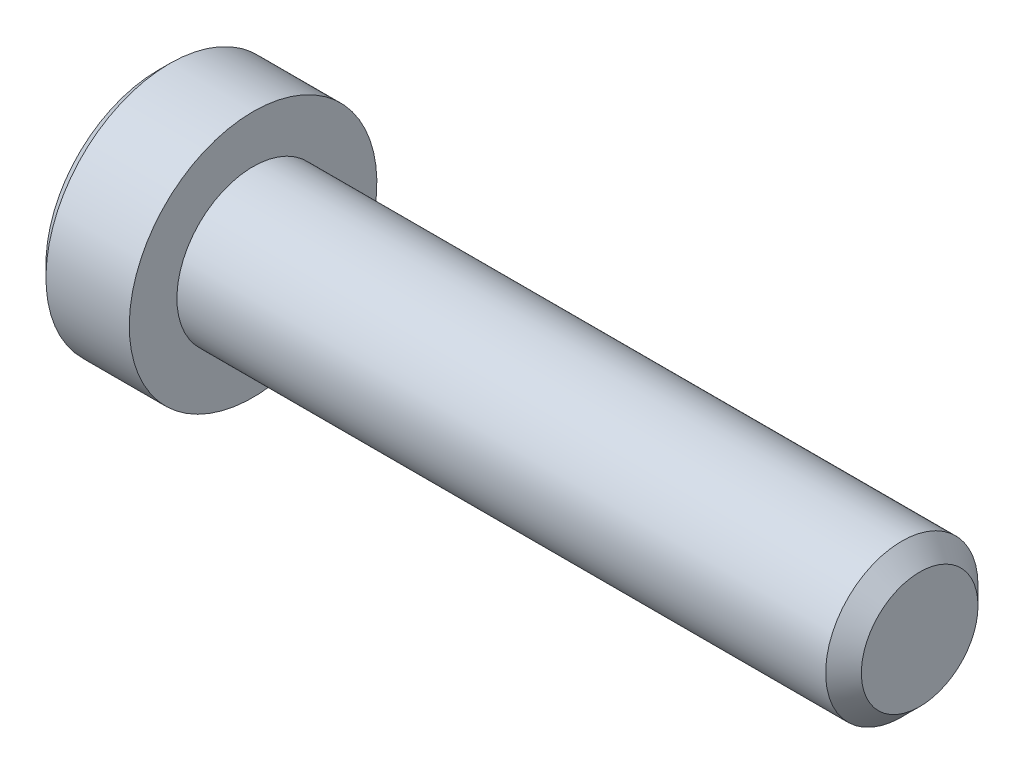
ISO-10303-21;
HEADER;
FILE_DESCRIPTION(('STEP AP214'),'2;1');
FILE_NAME('part.step','',(''),(''),'','','');
FILE_SCHEMA(('AUTOMOTIVE_DESIGN { 1 0 10303 214 1 1 1 1 }'));
ENDSEC;
DATA;
#1=APPLICATION_CONTEXT('core data for automotive mechanical design processes');
#2=APPLICATION_PROTOCOL_DEFINITION('international standard','automotive_design',2000,#1);
#3=PRODUCT_CONTEXT('',#1,'mechanical');
#4=PRODUCT('Part','Part','',(#3));
#5=PRODUCT_RELATED_PRODUCT_CATEGORY('part','',(#4));
#6=PRODUCT_DEFINITION_FORMATION('','',#4);
#7=PRODUCT_DEFINITION_CONTEXT('part definition',#1,'design');
#8=PRODUCT_DEFINITION('design','',#6,#7);
#9=PRODUCT_DEFINITION_SHAPE('','',#8);
#10=(LENGTH_UNIT() NAMED_UNIT(*) SI_UNIT(.MILLI.,.METRE.));
#11=(NAMED_UNIT(*) PLANE_ANGLE_UNIT() SI_UNIT($,.RADIAN.));
#12=(NAMED_UNIT(*) SI_UNIT($,.STERADIAN.) SOLID_ANGLE_UNIT());
#13=UNCERTAINTY_MEASURE_WITH_UNIT(LENGTH_MEASURE(1.E-05),#10,'distance_accuracy_value','');
#14=(GEOMETRIC_REPRESENTATION_CONTEXT(3) GLOBAL_UNCERTAINTY_ASSIGNED_CONTEXT((#13)) GLOBAL_UNIT_ASSIGNED_CONTEXT((#10,
#11,#12)) REPRESENTATION_CONTEXT('',''));
#15=CARTESIAN_POINT('',(0.,0.,0.));
#16=DIRECTION('',(0.,0.,1.));
#17=DIRECTION('',(1.,0.,0.));
#18=AXIS2_PLACEMENT_3D('',#15,#16,#17);
#19=CARTESIAN_POINT('',(-22.5,5.87499999999999,0.));
#20=DIRECTION('',(-1.,0.,0.));
#21=DIRECTION('',(0.,-1.,0.));
#22=AXIS2_PLACEMENT_3D('',#19,#20,#21);
#23=PLANE('',#22);
#24=CARTESIAN_POINT('',(-22.5,0.,0.));
#25=DIRECTION('',(-1.,0.,0.));
#26=DIRECTION('',(0.,-1.,0.));
#27=AXIS2_PLACEMENT_3D('',#24,#25,#26);
#28=CIRCLE('',#27,2.88675134594805);
#29=CARTESIAN_POINT('',(-22.5,-2.886751345948,-2.18358317538581E-13));
#30=VERTEX_POINT('',#29);
#31=CARTESIAN_POINT('',(-22.5,-1.44337567297417,2.49999999999982));
#32=VERTEX_POINT('',#31);
#33=EDGE_CURVE('E142',#30,#32,#28,.T.);
#34=ORIENTED_EDGE('',*,*,#33,.F.);
#35=CARTESIAN_POINT('',(-22.5,-1.44337567297406,-2.5));
#36=VERTEX_POINT('',#35);
#37=EDGE_CURVE('E139',#36,#30,#28,.T.);
#38=ORIENTED_EDGE('',*,*,#37,.F.);
#39=CARTESIAN_POINT('',(-22.5,1.44337567297394,-2.5));
#40=VERTEX_POINT('',#39);
#41=EDGE_CURVE('E107',#40,#36,#28,.T.);
#42=ORIENTED_EDGE('',*,*,#41,.F.);
#43=CARTESIAN_POINT('',(-22.5,2.88675134594809,0.));
#44=VERTEX_POINT('',#43);
#45=EDGE_CURVE('E99',#44,#40,#28,.T.);
#46=ORIENTED_EDGE('',*,*,#45,.F.);
#47=CARTESIAN_POINT('',(-22.5,1.44337567297394,2.5));
#48=VERTEX_POINT('',#47);
#49=EDGE_CURVE('E60',#48,#44,#28,.T.);
#50=ORIENTED_EDGE('',*,*,#49,.F.);
#51=EDGE_CURVE('E67',#32,#48,#28,.T.);
#52=ORIENTED_EDGE('',*,*,#51,.F.);
#53=EDGE_LOOP('',(#34,#38,#42,#46,#50,#52));
#54=FACE_BOUND('',#53,.T.);
#55=CARTESIAN_POINT('',(-22.5,0.,0.));
#56=DIRECTION('',(1.,0.,0.));
#57=DIRECTION('',(0.,1.,0.));
#58=AXIS2_PLACEMENT_3D('',#55,#56,#57);
#59=CIRCLE('',#58,5.87499999999999);
#60=CARTESIAN_POINT('',(-22.5,5.87499999999999,0.));
#61=VERTEX_POINT('',#60);
#62=EDGE_CURVE('E237',#61,#61,#59,.T.);
#63=ORIENTED_EDGE('',*,*,#62,.F.);
#64=EDGE_LOOP('',(#63));
#65=FACE_BOUND('',#64,.T.);
#66=ADVANCED_FACE('F39',(#54,#65),#23,.T.);
#67=CARTESIAN_POINT('',(-4.5,0.,0.));
#68=DIRECTION('',(1.,0.,0.));
#69=DIRECTION('',(0.,0.,-1.));
#70=AXIS2_PLACEMENT_3D('',#67,#68,#69);
#71=CYLINDRICAL_SURFACE('',#70,4.);
#72=CARTESIAN_POINT('',(16.5625,0.,0.));
#73=DIRECTION('',(1.,0.,0.));
#74=DIRECTION('',(0.,0.,-1.));
#75=AXIS2_PLACEMENT_3D('',#72,#73,#74);
#76=CIRCLE('',#75,4.);
#77=CARTESIAN_POINT('',(16.5625,0.,-4.));
#78=VERTEX_POINT('',#77);
#79=EDGE_CURVE('E54',#78,#78,#76,.F.);
#80=ORIENTED_EDGE('',*,*,#79,.T.);
#81=EDGE_LOOP('',(#80));
#82=FACE_BOUND('',#81,.T.);
#83=CARTESIAN_POINT('',(-17.5,0.,0.));
#84=DIRECTION('',(-1.,0.,0.));
#85=DIRECTION('',(0.,-1.,0.));
#86=AXIS2_PLACEMENT_3D('',#83,#84,#85);
#87=CIRCLE('',#86,4.);
#88=CARTESIAN_POINT('',(-17.5,-4.00000000000001,0.));
#89=VERTEX_POINT('',#88);
#90=EDGE_CURVE('E227',#89,#89,#87,.T.);
#91=ORIENTED_EDGE('',*,*,#90,.F.);
#92=EDGE_LOOP('',(#91));
#93=FACE_BOUND('',#92,.T.);
#94=ADVANCED_FACE('F207',(#82,#93),#71,.T.);
#95=CARTESIAN_POINT('',(17.5,0.,0.));
#96=DIRECTION('',(1.,0.,0.));
#97=DIRECTION('',(0.,0.,-1.));
#98=AXIS2_PLACEMENT_3D('',#95,#96,#97);
#99=PLANE('',#98);
#100=CARTESIAN_POINT('',(17.5,0.,0.));
#101=DIRECTION('',(1.,0.,0.));
#102=DIRECTION('',(0.,0.,-1.));
#103=AXIS2_PLACEMENT_3D('',#100,#101,#102);
#104=CIRCLE('',#103,3.0625);
#105=CARTESIAN_POINT('',(17.5,0.,-3.0625));
#106=VERTEX_POINT('',#105);
#107=EDGE_CURVE('E229',#106,#106,#104,.T.);
#108=ORIENTED_EDGE('',*,*,#107,.T.);
#109=EDGE_LOOP('',(#108));
#110=FACE_BOUND('',#109,.T.);
#111=ADVANCED_FACE('F215',(#110),#99,.T.);
#112=CARTESIAN_POINT('',(17.5,0.,0.));
#113=DIRECTION('',(-1.,0.,0.));
#114=DIRECTION('',(0.,0.,1.));
#115=AXIS2_PLACEMENT_3D('',#112,#113,#114);
#116=CONICAL_SURFACE('',#115,3.0625,0.785398163397447);
#117=ORIENTED_EDGE('',*,*,#79,.F.);
#118=EDGE_LOOP('',(#117));
#119=FACE_BOUND('',#118,.T.);
#120=ORIENTED_EDGE('',*,*,#107,.F.);
#121=EDGE_LOOP('',(#120));
#122=FACE_BOUND('',#121,.T.);
#123=ADVANCED_FACE('F41',(#119,#122),#116,.T.);
#124=CARTESIAN_POINT('',(-17.5,0.,0.));
#125=DIRECTION('',(1.,0.,0.));
#126=DIRECTION('',(0.,1.,0.));
#127=AXIS2_PLACEMENT_3D('',#124,#125,#126);
#128=CYLINDRICAL_SURFACE('',#127,6.5);
#129=CARTESIAN_POINT('',(-21.875,0.,0.));
#130=DIRECTION('',(1.,0.,0.));
#131=DIRECTION('',(0.,1.,0.));
#132=AXIS2_PLACEMENT_3D('',#129,#130,#131);
#133=CIRCLE('',#132,6.5);
#134=CARTESIAN_POINT('',(-21.875,6.49999999999999,0.));
#135=VERTEX_POINT('',#134);
#136=EDGE_CURVE('E230',#135,#135,#133,.T.);
#137=ORIENTED_EDGE('',*,*,#136,.T.);
#138=EDGE_LOOP('',(#137));
#139=FACE_BOUND('',#138,.T.);
#140=CARTESIAN_POINT('',(-17.5,0.,0.));
#141=DIRECTION('',(1.,0.,0.));
#142=DIRECTION('',(0.,1.,0.));
#143=AXIS2_PLACEMENT_3D('',#140,#141,#142);
#144=CIRCLE('',#143,6.5);
#145=CARTESIAN_POINT('',(-17.5,6.49999999999999,0.));
#146=VERTEX_POINT('',#145);
#147=EDGE_CURVE('E244',#146,#146,#144,.T.);
#148=ORIENTED_EDGE('',*,*,#147,.F.);
#149=EDGE_LOOP('',(#148));
#150=FACE_BOUND('',#149,.T.);
#151=ADVANCED_FACE('F210',(#139,#150),#128,.T.);
#152=CARTESIAN_POINT('',(-21.875,0.,0.));
#153=DIRECTION('',(1.,0.,0.));
#154=DIRECTION('',(0.,1.,0.));
#155=AXIS2_PLACEMENT_3D('',#152,#153,#154);
#156=CONICAL_SURFACE('',#155,6.5,0.785398163397449);
#157=ORIENTED_EDGE('',*,*,#62,.T.);
#158=EDGE_LOOP('',(#157));
#159=FACE_BOUND('',#158,.T.);
#160=ORIENTED_EDGE('',*,*,#136,.F.);
#161=EDGE_LOOP('',(#160));
#162=FACE_BOUND('',#161,.T.);
#163=ADVANCED_FACE('F203',(#159,#162),#156,.T.);
#164=CARTESIAN_POINT('',(-17.5,6.49999999999999,0.));
#165=DIRECTION('',(1.,0.,0.));
#166=DIRECTION('',(0.,1.,0.));
#167=AXIS2_PLACEMENT_3D('',#164,#165,#166);
#168=PLANE('',#167);
#169=ORIENTED_EDGE('',*,*,#90,.T.);
#170=EDGE_LOOP('',(#169));
#171=FACE_BOUND('',#170,.T.);
#172=ORIENTED_EDGE('',*,*,#147,.T.);
#173=EDGE_LOOP('',(#172));
#174=FACE_BOUND('',#173,.T.);
#175=ADVANCED_FACE('F166',(#171,#174),#168,.T.);
#176=CARTESIAN_POINT('',(-22.5,0.,0.));
#177=DIRECTION('',(-1.,0.,0.));
#178=DIRECTION('',(0.,-1.,0.));
#179=AXIS2_PLACEMENT_3D('',#176,#177,#178);
#180=CONICAL_SURFACE('',#179,2.88675134594805,0.78539816339745);
#181=CARTESIAN_POINT('',(-23.4259641937848,-2.87868021616152,-2.5));
#182=CARTESIAN_POINT('',(-23.3730547693996,-2.80858751756352,-2.5));
#183=CARTESIAN_POINT('',(-23.3206567848066,-2.73810237384455,-2.5));
#184=CARTESIAN_POINT('',(-23.2171126835153,-2.59619238907466,-2.5));
#185=CARTESIAN_POINT('',(-23.165966884378,-2.5247673165714,-2.5));
#186=CARTESIAN_POINT('',(-23.0647924979815,-2.38030019419695,-2.5));
#187=CARTESIAN_POINT('',(-23.0147756377846,-2.30724990359397,-2.5));
#188=CARTESIAN_POINT('',(-22.9166088439156,-2.15990937397291,-2.5));
#189=CARTESIAN_POINT('',(-22.8684587783456,-2.0856192230894,-2.5));
#190=CARTESIAN_POINT('',(-22.7717465594521,-1.93130274871405,-2.5));
#191=CARTESIAN_POINT('',(-22.7233189325374,-1.85119168497847,-2.5));
#192=CARTESIAN_POINT('',(-22.6296640597042,-1.68912282627164,-2.5));
#193=CARTESIAN_POINT('',(-22.5844363916949,-1.60716527674861,-2.5));
#194=CARTESIAN_POINT('',(-22.4981353746694,-1.44137668632316,-2.5));
#195=CARTESIAN_POINT('',(-22.4570503726637,-1.35755175925792,-2.5));
#196=CARTESIAN_POINT('',(-22.3799618661067,-1.18761577759417,-2.5));
#197=CARTESIAN_POINT('',(-22.3439560607347,-1.10150577924726,-2.5));
#198=CARTESIAN_POINT('',(-22.2809497442852,-0.933895283730341,-2.5));
#199=CARTESIAN_POINT('',(-22.2534577201432,-0.852581486652378,-2.5));
#200=CARTESIAN_POINT('',(-22.2049971144175,-0.68799618505139,-2.5));
#201=CARTESIAN_POINT('',(-22.1840289822391,-0.604724546085127,-2.5));
#202=CARTESIAN_POINT('',(-22.1500599950131,-0.438105786501612,-2.5));
#203=CARTESIAN_POINT('',(-22.1369226334437,-0.354786957377844,-2.5));
#204=CARTESIAN_POINT('',(-22.1188701943997,-0.187258638268733,-2.5));
#205=CARTESIAN_POINT('',(-22.1139537035303,-0.103049303891694,-2.5));
#206=CARTESIAN_POINT('',(-22.112708074372,0.0623819458555894,-2.5));
#207=CARTESIAN_POINT('',(-22.116074551711,0.143601667742535,-2.5));
#208=CARTESIAN_POINT('',(-22.130537592381,0.305344840534005,-2.5));
#209=CARTESIAN_POINT('',(-22.1416349066532,0.385868223029699,-2.5));
#210=CARTESIAN_POINT('',(-22.1711420785854,0.546999992477772,-2.5));
#211=CARTESIAN_POINT('',(-22.189676376831,0.627585258156421,-2.5));
#212=CARTESIAN_POINT('',(-22.2330723320142,0.786991930978629,-2.5));
#213=CARTESIAN_POINT('',(-22.2579334595175,0.865813485110866,-2.5));
#214=CARTESIAN_POINT('',(-22.3455589112399,1.11399280220495,-2.5));
#215=CARTESIAN_POINT('',(-22.4183033354747,1.2798402752946,-2.5));
#216=CARTESIAN_POINT('',(-22.5395423452679,1.52253018655043,-2.5));
#217=CARTESIAN_POINT('',(-22.5820714512073,1.60256472908883,-2.5));
#218=CARTESIAN_POINT('',(-22.6703965241523,1.76081489282128,-2.5));
#219=CARTESIAN_POINT('',(-22.7161919024768,1.83903083842891,-2.5));
#220=CARTESIAN_POINT('',(-22.8080446787287,1.99000684607172,-2.5));
#221=CARTESIAN_POINT('',(-22.8539756354245,2.06284472030448,-2.5));
#222=CARTESIAN_POINT('',(-22.9477702453866,2.20727164736139,-2.5));
#223=CARTESIAN_POINT('',(-22.9956340450437,2.27886060500406,-2.5));
#224=CARTESIAN_POINT('',(-23.0925522363184,2.42037078548407,-2.5));
#225=CARTESIAN_POINT('',(-23.1415937983163,2.49030083172882,-2.5));
#226=CARTESIAN_POINT('',(-23.2409738351899,2.62920524991562,-2.5));
#227=CARTESIAN_POINT('',(-23.2913119497075,2.69817987937843,-2.5));
#228=CARTESIAN_POINT('',(-23.3421802976825,2.76675463365827,-2.5));
#229=B_SPLINE_CURVE_WITH_KNOTS('',3,(#181,#182,#183,#184,#185,#186,#187,#188,#189,#190,#191,
#192,#193,#194,#195,#196,#197,#198,#199,#200,#201,#202,#203,#204,#205,#206,#207,#208,#209,#210,
#211,#212,#213,#214,#215,#216,#217,#218,#219,#220,#221,#222,#223,#224,#225,#226,#227,#228),
.UNSPECIFIED.,.F.,.F.,(4,2,2,2,2,2,2,2,2,2,2,2,2,2,2,2,2,2,2,2,2,2,2,4),(0.,0.263465914971116,
0.526997968323241,0.792571943279366,1.05812711983772,1.33890112548019,1.6196380262908,
1.89956181222217,2.17935838571898,2.43663887682601,2.69393708705249,2.94660788173137,
3.19923523085018,3.44271854486788,3.68622551313361,3.93398926860575,4.1817322978197,
4.7233400484191,4.99521600382016,5.26704308216968,5.52534341671995,5.78366335141088,
6.03988492204048,6.29603603207542),.UNSPECIFIED.);
#230=EDGE_CURVE('E11',#36,#40,#229,.T.);
#231=ORIENTED_EDGE('',*,*,#230,.T.);
#232=ORIENTED_EDGE('',*,*,#41,.T.);
#233=EDGE_LOOP('',(#231,#232));
#234=FACE_BOUND('',#233,.T.);
#235=ADVANCED_FACE('F112',(#234),#180,.F.);
#236=CARTESIAN_POINT('',(-22.5001154769819,-2.88686681600197,0.000200000000000396));
#237=CARTESIAN_POINT('',(-22.4505407053549,-2.83725032818751,-0.0857382777877663));
#238=CARTESIAN_POINT('',(-22.4038774813626,-2.78680418128109,-0.173113567275756));
#239=CARTESIAN_POINT('',(-22.3184381400384,-2.6839389026696,-0.351281456165594));
#240=CARTESIAN_POINT('',(-22.2797095624061,-2.6315099876986,-0.442091000681081));
#241=CARTESIAN_POINT('',(-22.2133667038979,-2.52578957716233,-0.625204123126929));
#242=CARTESIAN_POINT('',(-22.185585668531,-2.47252500720903,-0.71746106452935));
#243=CARTESIAN_POINT('',(-22.1427831759108,-2.36482323343209,-0.904006008776298));
#244=CARTESIAN_POINT('',(-22.1277297666715,-2.31038931995912,-0.998288312566297));
#245=CARTESIAN_POINT('',(-22.1141477222096,-2.21657570605386,-1.16077825829186));
#246=CARTESIAN_POINT('',(-22.1121370992409,-2.17731721011877,-1.22877596788017));
#247=CARTESIAN_POINT('',(-22.1155241171876,-2.09886438835669,-1.36466024116924));
#248=CARTESIAN_POINT('',(-22.1209243553,-2.05967008984861,-1.43254675755226));
#249=CARTESIAN_POINT('',(-22.1388257884026,-1.98165157555713,-1.56767878823613));
#250=CARTESIAN_POINT('',(-22.1513349270466,-1.94282782326095,-1.63492349975358));
#251=CARTESIAN_POINT('',(-22.1827675019558,-1.86585167424615,-1.76825010081822));
#252=CARTESIAN_POINT('',(-22.201690446497,-1.82769922629676,-1.83433207909968));
#253=CARTESIAN_POINT('',(-22.2578673614084,-1.72997445583857,-2.00359634669128));
#254=CARTESIAN_POINT('',(-22.2993558315963,-1.6710080703923,-2.10572912222291));
#255=CARTESIAN_POINT('',(-22.3693940467232,-1.58430317001562,-2.25590641494052));
#256=CARTESIAN_POINT('',(-22.3940022521162,-1.55573003305807,-2.30539653988262));
#257=CARTESIAN_POINT('',(-22.4454618867153,-1.49911303110425,-2.40346006383885));
#258=CARTESIAN_POINT('',(-22.4723119387795,-1.47106885396706,-2.45203400349693));
#259=CARTESIAN_POINT('',(-22.5001154769819,-1.44326020292023,-2.5002));
#260=B_SPLINE_CURVE_WITH_KNOTS('',3,(#236,#237,#238,#239,#240,#241,#242,#243,#244,#245,#246,
#247,#248,#249,#250,#251,#252,#253,#254,#255,#256,#257,#258,#259),.UNSPECIFIED.,.F.,.F.,(4,2,2,
2,2,2,2,2,2,2,2,4),(0.,0.33301208513393,0.667964518301407,0.997597032043313,1.32639954393846,
1.56169424147171,1.79707142102085,2.03271213522174,2.26833478775654,2.64260240809534,
2.82922877818864,3.01574133749024),.UNSPECIFIED.);
#261=EDGE_CURVE('E145',#30,#36,#260,.T.);
#262=ORIENTED_EDGE('',*,*,#261,.T.);
#263=ORIENTED_EDGE('',*,*,#37,.T.);
#264=EDGE_LOOP('',(#262,#263));
#265=FACE_BOUND('',#264,.T.);
#266=ADVANCED_FACE('F165',(#265),#180,.F.);
#267=CARTESIAN_POINT('',(-22.5001154769819,-1.44326020292023,2.5002));
#268=CARTESIAN_POINT('',(-22.4505407053548,-1.49287669073468,2.41426172221224));
#269=CARTESIAN_POINT('',(-22.4038774813626,-1.5433228376411,2.32688643272425));
#270=CARTESIAN_POINT('',(-22.3184381400384,-1.64618811625259,2.14871854383442));
#271=CARTESIAN_POINT('',(-22.2797095624061,-1.69861703122359,2.05790899931893));
#272=CARTESIAN_POINT('',(-22.2133667038979,-1.80433744175985,1.87479587687309));
#273=CARTESIAN_POINT('',(-22.185585668531,-1.85760201171315,1.78253893547067));
#274=CARTESIAN_POINT('',(-22.1427831759108,-1.96530378549008,1.59599399122373));
#275=CARTESIAN_POINT('',(-22.1277297666715,-2.01973769896306,1.50171168743373));
#276=CARTESIAN_POINT('',(-22.1141477222096,-2.11355131286832,1.33922174170817));
#277=CARTESIAN_POINT('',(-22.1121370992409,-2.1528098088034,1.27122403211986));
#278=CARTESIAN_POINT('',(-22.1155241171876,-2.23126263056549,1.13533975883079));
#279=CARTESIAN_POINT('',(-22.1209243553,-2.27045692907357,1.06745324244777));
#280=CARTESIAN_POINT('',(-22.1388257884026,-2.34847544336504,0.932321211763906));
#281=CARTESIAN_POINT('',(-22.1513349270466,-2.38729919566122,0.86507650024645));
#282=CARTESIAN_POINT('',(-22.1827675019558,-2.46427534467603,0.731749899181811));
#283=CARTESIAN_POINT('',(-22.201690446497,-2.50242779262541,0.665667920900352));
#284=CARTESIAN_POINT('',(-22.2578673614084,-2.60015256308361,0.496403653308742));
#285=CARTESIAN_POINT('',(-22.2993558315963,-2.65911894852988,0.394270877777112));
#286=CARTESIAN_POINT('',(-22.3693940467232,-2.74582384890657,0.244093585059495));
#287=CARTESIAN_POINT('',(-22.3940022521162,-2.77439698586412,0.194603460117394));
#288=CARTESIAN_POINT('',(-22.4454618867154,-2.83101398781794,0.096539936161156));
#289=CARTESIAN_POINT('',(-22.4723119387795,-2.85905816495513,0.0479659965030741));
#290=CARTESIAN_POINT('',(-22.5001154769819,-2.88686681600197,-0.000199999999999266));
#291=B_SPLINE_CURVE_WITH_KNOTS('',3,(#267,#268,#269,#270,#271,#272,#273,#274,#275,#276,#277,
#278,#279,#280,#281,#282,#283,#284,#285,#286,#287,#288,#289,#290),.UNSPECIFIED.,.F.,.F.,(4,2,2,
2,2,2,2,2,2,2,2,4),(0.,0.333012085133918,0.667964518301386,0.997597032043283,1.32639954393842,
1.56169424147167,1.79707142102081,2.03271213522169,2.26833478775649,2.64260240809532,
2.82922877818863,3.01574133749024),.UNSPECIFIED.);
#292=EDGE_CURVE('E153',#32,#30,#291,.T.);
#293=ORIENTED_EDGE('',*,*,#292,.T.);
#294=ORIENTED_EDGE('',*,*,#33,.T.);
#295=EDGE_LOOP('',(#293,#294));
#296=FACE_BOUND('',#295,.T.);
#297=ADVANCED_FACE('F291',(#296),#180,.F.);
#298=CARTESIAN_POINT('',(-23.4259641937848,-2.87868021616152,2.5));
#299=CARTESIAN_POINT('',(-23.3730547693996,-2.80858751756352,2.5));
#300=CARTESIAN_POINT('',(-23.3206567848066,-2.73810237384455,2.5));
#301=CARTESIAN_POINT('',(-23.2171126835153,-2.59619238907467,2.5));
#302=CARTESIAN_POINT('',(-23.165966884378,-2.5247673165714,2.5));
#303=CARTESIAN_POINT('',(-23.0647924979815,-2.38030019419695,2.5));
#304=CARTESIAN_POINT('',(-23.0147756377846,-2.30724990359397,2.5));
#305=CARTESIAN_POINT('',(-22.9166088439156,-2.15990937397291,2.5));
#306=CARTESIAN_POINT('',(-22.8684587783456,-2.0856192230894,2.5));
#307=CARTESIAN_POINT('',(-22.7717465594521,-1.93130274871405,2.5));
#308=CARTESIAN_POINT('',(-22.7233189325374,-1.85119168497847,2.5));
#309=CARTESIAN_POINT('',(-22.6296640597042,-1.68912282627164,2.5));
#310=CARTESIAN_POINT('',(-22.5844363916949,-1.60716527674861,2.5));
#311=CARTESIAN_POINT('',(-22.4981353746694,-1.44137668632315,2.5));
#312=CARTESIAN_POINT('',(-22.4570503726637,-1.35755175925792,2.5));
#313=CARTESIAN_POINT('',(-22.3799618661067,-1.18761577759417,2.5));
#314=CARTESIAN_POINT('',(-22.3439560607347,-1.10150577924726,2.5));
#315=CARTESIAN_POINT('',(-22.2809497442852,-0.93389528373034,2.5));
#316=CARTESIAN_POINT('',(-22.2534577201432,-0.852581486652378,2.5));
#317=CARTESIAN_POINT('',(-22.2049971144175,-0.687996185051391,2.5));
#318=CARTESIAN_POINT('',(-22.1840289822391,-0.604724546085127,2.5));
#319=CARTESIAN_POINT('',(-22.1500599950131,-0.438105786501613,2.5));
#320=CARTESIAN_POINT('',(-22.1369226334437,-0.354786957377844,2.5));
#321=CARTESIAN_POINT('',(-22.1188701943997,-0.187258638268734,2.5));
#322=CARTESIAN_POINT('',(-22.1139537035303,-0.103049303891695,2.5));
#323=CARTESIAN_POINT('',(-22.112708074372,0.0623819458555882,2.5));
#324=CARTESIAN_POINT('',(-22.116074551711,0.143601667742533,2.5));
#325=CARTESIAN_POINT('',(-22.130537592381,0.305344840534004,2.5));
#326=CARTESIAN_POINT('',(-22.1416349066532,0.385868223029698,2.5));
#327=CARTESIAN_POINT('',(-22.1711420785854,0.546999992477771,2.5));
#328=CARTESIAN_POINT('',(-22.189676376831,0.62758525815642,2.5));
#329=CARTESIAN_POINT('',(-22.2330723320142,0.786991930978628,2.5));
#330=CARTESIAN_POINT('',(-22.2579334595175,0.865813485110865,2.5));
#331=CARTESIAN_POINT('',(-22.3455589112399,1.11399280220495,2.5));
#332=CARTESIAN_POINT('',(-22.4183033354747,1.2798402752946,2.5));
#333=CARTESIAN_POINT('',(-22.5395423452679,1.52253018655042,2.5));
#334=CARTESIAN_POINT('',(-22.5820714512073,1.60256472908883,2.5));
#335=CARTESIAN_POINT('',(-22.6703965241523,1.76081489282128,2.5));
#336=CARTESIAN_POINT('',(-22.7161919024768,1.8390308384289,2.5));
#337=CARTESIAN_POINT('',(-22.8080446787287,1.99000684607171,2.5));
#338=CARTESIAN_POINT('',(-22.8539756354245,2.06284472030448,2.5));
#339=CARTESIAN_POINT('',(-22.9477702453866,2.20727164736139,2.5));
#340=CARTESIAN_POINT('',(-22.9956340450437,2.27886060500406,2.5));
#341=CARTESIAN_POINT('',(-23.0925522363184,2.42037078548406,2.5));
#342=CARTESIAN_POINT('',(-23.1415937983163,2.49030083172882,2.5));
#343=CARTESIAN_POINT('',(-23.2409738351899,2.62920524991562,2.5));
#344=CARTESIAN_POINT('',(-23.2913119497075,2.69817987937843,2.5));
#345=CARTESIAN_POINT('',(-23.3421802976825,2.76675463365827,2.5));
#346=B_SPLINE_CURVE_WITH_KNOTS('',3,(#298,#299,#300,#301,#302,#303,#304,#305,#306,#307,#308,
#309,#310,#311,#312,#313,#314,#315,#316,#317,#318,#319,#320,#321,#322,#323,#324,#325,#326,#327,
#328,#329,#330,#331,#332,#333,#334,#335,#336,#337,#338,#339,#340,#341,#342,#343,#344,#345),
.UNSPECIFIED.,.F.,.F.,(4,2,2,2,2,2,2,2,2,2,2,2,2,2,2,2,2,2,2,2,2,2,2,4),(0.,0.263465914971117,
0.526997968323243,0.792571943279369,1.05812711983772,1.3389011254802,1.6196380262908,
1.89956181222218,2.17935838571899,2.43663887682602,2.69393708705249,2.94660788173137,
3.19923523085018,3.44271854486788,3.68622551313362,3.93398926860575,4.1817322978197,
4.7233400484191,4.99521600382016,5.26704308216968,5.52534341671995,5.78366335141087,
6.03988492204048,6.29603603207542),.UNSPECIFIED.);
#347=EDGE_CURVE('E173',#48,#32,#346,.F.);
#348=ORIENTED_EDGE('',*,*,#347,.T.);
#349=ORIENTED_EDGE('',*,*,#51,.T.);
#350=EDGE_LOOP('',(#348,#349));
#351=FACE_BOUND('',#350,.T.);
#352=ADVANCED_FACE('F309',(#351),#180,.F.);
#353=CARTESIAN_POINT('',(-22.5001154769818,2.88686681600197,-0.000199999999999272));
#354=CARTESIAN_POINT('',(-22.4505407053548,2.83725032818751,0.0857382777877651));
#355=CARTESIAN_POINT('',(-22.4038774813625,2.7868041812811,0.173113567275753));
#356=CARTESIAN_POINT('',(-22.3184381400383,2.6839389026696,0.351281456165586));
#357=CARTESIAN_POINT('',(-22.279709562406,2.6315099876986,0.44209100068107));
#358=CARTESIAN_POINT('',(-22.2133667038978,2.52578957716234,0.625204123126914));
#359=CARTESIAN_POINT('',(-22.1855856685309,2.47252500720904,0.717461064529332));
#360=CARTESIAN_POINT('',(-22.1427831759107,2.36482323343211,0.904006008776275));
#361=CARTESIAN_POINT('',(-22.1277297666714,2.31038931995913,0.998288312566271));
#362=CARTESIAN_POINT('',(-22.1141477222095,2.21657570605388,1.16077825829183));
#363=CARTESIAN_POINT('',(-22.1121370992408,2.17731721011879,1.22877596788013));
#364=CARTESIAN_POINT('',(-22.1155241171875,2.09886438835671,1.3646602411692));
#365=CARTESIAN_POINT('',(-22.1209243552999,2.05967008984863,1.43254675755222));
#366=CARTESIAN_POINT('',(-22.1388257884025,1.98165157555716,1.56767878823609));
#367=CARTESIAN_POINT('',(-22.1513349270465,1.94282782326098,1.63492349975354));
#368=CARTESIAN_POINT('',(-22.1827675019558,1.86585167424617,1.76825010081818));
#369=CARTESIAN_POINT('',(-22.2016904464969,1.82769922629679,1.83433207909963));
#370=CARTESIAN_POINT('',(-22.2578673614083,1.72997445583859,2.00359634669124));
#371=CARTESIAN_POINT('',(-22.2993558315962,1.67100807039232,2.10572912222288));
#372=CARTESIAN_POINT('',(-22.3693940467231,1.58430317001563,2.2559064149405));
#373=CARTESIAN_POINT('',(-22.3940022521161,1.55573003305808,2.3053965398826));
#374=CARTESIAN_POINT('',(-22.4454618867153,1.49911303110426,2.40346006383884));
#375=CARTESIAN_POINT('',(-22.4723119387794,1.47106885396706,2.45203400349693));
#376=CARTESIAN_POINT('',(-22.5001154769818,1.44326020292023,2.5002));
#377=B_SPLINE_CURVE_WITH_KNOTS('',3,(#353,#354,#355,#356,#357,#358,#359,#360,#361,#362,#363,
#364,#365,#366,#367,#368,#369,#370,#371,#372,#373,#374,#375,#376),.UNSPECIFIED.,.F.,.F.,(4,2,2,
2,2,2,2,2,2,2,2,4),(0.,0.333012085133919,0.667964518301388,0.997597032043285,1.32639954393842,
1.56169424147166,1.7970714210208,2.03271213522168,2.26833478775647,2.64260240809532,
2.82922877818863,3.01574133749025),.UNSPECIFIED.);
#378=EDGE_CURVE('E128',#44,#48,#377,.T.);
#379=ORIENTED_EDGE('',*,*,#378,.T.);
#380=ORIENTED_EDGE('',*,*,#49,.T.);
#381=EDGE_LOOP('',(#379,#380));
#382=FACE_BOUND('',#381,.T.);
#383=ADVANCED_FACE('F281',(#382),#180,.F.);
#384=CARTESIAN_POINT('',(-22.5001154769818,1.44326020292023,-2.5002));
#385=CARTESIAN_POINT('',(-22.4505407053548,1.49287669073469,-2.41426172221224));
#386=CARTESIAN_POINT('',(-22.4038774813626,1.5433228376411,-2.32688643272425));
#387=CARTESIAN_POINT('',(-22.3184381400384,1.64618811625259,-2.14871854383441));
#388=CARTESIAN_POINT('',(-22.2797095624061,1.6986170312236,-2.05790899931892));
#389=CARTESIAN_POINT('',(-22.2133667038978,1.80433744175986,-1.87479587687307));
#390=CARTESIAN_POINT('',(-22.1855856685309,1.85760201171316,-1.78253893547065));
#391=CARTESIAN_POINT('',(-22.1427831759107,1.9653037854901,-1.5959939912237));
#392=CARTESIAN_POINT('',(-22.1277297666714,2.01973769896307,-1.5017116874337));
#393=CARTESIAN_POINT('',(-22.1141477222095,2.11355131286834,-1.33922174170814));
#394=CARTESIAN_POINT('',(-22.1121370992408,2.15280980880342,-1.27122403211983));
#395=CARTESIAN_POINT('',(-22.1155241171875,2.2312626305655,-1.13533975883077));
#396=CARTESIAN_POINT('',(-22.1209243552999,2.27045692907358,-1.06745324244775));
#397=CARTESIAN_POINT('',(-22.1388257884025,2.34847544336505,-0.932321211763882));
#398=CARTESIAN_POINT('',(-22.1513349270465,2.38729919566123,-0.865076500246428));
#399=CARTESIAN_POINT('',(-22.1827675019558,2.46427534467604,-0.731749899181791));
#400=CARTESIAN_POINT('',(-22.2016904464969,2.50242779262542,-0.665667920900334));
#401=CARTESIAN_POINT('',(-22.2578673614083,2.60015256308362,-0.496403653308729));
#402=CARTESIAN_POINT('',(-22.2993558315962,2.65911894852989,-0.394270877777102));
#403=CARTESIAN_POINT('',(-22.3693940467231,2.74582384890657,-0.244093585059489));
#404=CARTESIAN_POINT('',(-22.3940022521161,2.77439698586412,-0.194603460117389));
#405=CARTESIAN_POINT('',(-22.4454618867153,2.83101398781794,-0.0965399361611533));
#406=CARTESIAN_POINT('',(-22.4723119387794,2.85905816495513,-0.0479659965030724));
#407=CARTESIAN_POINT('',(-22.5001154769818,2.88686681600197,0.000199999999999518));
#408=B_SPLINE_CURVE_WITH_KNOTS('',3,(#384,#385,#386,#387,#388,#389,#390,#391,#392,#393,#394,
#395,#396,#397,#398,#399,#400,#401,#402,#403,#404,#405,#406,#407),.UNSPECIFIED.,.F.,.F.,(4,2,2,
2,2,2,2,2,2,2,2,4),(0.,0.333012085133929,0.667964518301408,0.997597032043317,1.32639954393847,
1.56169424147171,1.79707142102085,2.03271213522172,2.26833478775652,2.64260240809534,
2.82922877818864,3.01574133749025),.UNSPECIFIED.);
#409=EDGE_CURVE('E102',#40,#44,#408,.T.);
#410=ORIENTED_EDGE('',*,*,#409,.T.);
#411=ORIENTED_EDGE('',*,*,#45,.T.);
#412=EDGE_LOOP('',(#410,#411));
#413=FACE_BOUND('',#412,.T.);
#414=ADVANCED_FACE('F100',(#413),#180,.F.);
#415=CARTESIAN_POINT('',(-18.55,2.88675134594813,0.));
#416=DIRECTION('',(1.,0.,0.));
#417=DIRECTION('',(0.,0.,-1.));
#418=AXIS2_PLACEMENT_3D('',#415,#416,#417);
#419=PLANE('',#418);
#420=DIRECTION('',(0.,0.5,0.866025403784439));
#421=VECTOR('',#420,1.);
#422=CARTESIAN_POINT('',(-18.55,1.44337567297406,-2.5));
#423=LINE('',#422,#421);
#424=CARTESIAN_POINT('',(-18.55,1.44337567297406,-2.5));
#425=VERTEX_POINT('',#424);
#426=CARTESIAN_POINT('',(-18.55,2.88675134594813,0.));
#427=VERTEX_POINT('',#426);
#428=EDGE_CURVE('E127',#425,#427,#423,.T.);
#429=ORIENTED_EDGE('',*,*,#428,.F.);
#430=DIRECTION('',(0.,1.,0.));
#431=VECTOR('',#430,1.);
#432=CARTESIAN_POINT('',(-18.55,-1.44337567297406,-2.5));
#433=LINE('',#432,#431);
#434=CARTESIAN_POINT('',(-18.55,-1.44337567297406,-2.5));
#435=VERTEX_POINT('',#434);
#436=EDGE_CURVE('E132',#435,#425,#433,.T.);
#437=ORIENTED_EDGE('',*,*,#436,.F.);
#438=DIRECTION('',(0.,0.5,-0.866025403784439));
#439=VECTOR('',#438,1.);
#440=CARTESIAN_POINT('',(-18.55,-2.88675134594813,0.));
#441=LINE('',#440,#439);
#442=CARTESIAN_POINT('',(-18.55,-2.88675134594813,0.));
#443=VERTEX_POINT('',#442);
#444=EDGE_CURVE('E266',#443,#435,#441,.T.);
#445=ORIENTED_EDGE('',*,*,#444,.F.);
#446=DIRECTION('',(0.,-0.5,-0.866025403784439));
#447=VECTOR('',#446,1.);
#448=CARTESIAN_POINT('',(-18.55,-1.44337567297406,2.5));
#449=LINE('',#448,#447);
#450=CARTESIAN_POINT('',(-18.55,-1.44337567297406,2.5));
#451=VERTEX_POINT('',#450);
#452=EDGE_CURVE('E269',#451,#443,#449,.T.);
#453=ORIENTED_EDGE('',*,*,#452,.F.);
#454=DIRECTION('',(0.,-1.,0.));
#455=VECTOR('',#454,1.);
#456=CARTESIAN_POINT('',(-18.55,1.44337567297406,2.5));
#457=LINE('',#456,#455);
#458=CARTESIAN_POINT('',(-18.55,1.44337567297406,2.5));
#459=VERTEX_POINT('',#458);
#460=EDGE_CURVE('E272',#459,#451,#457,.T.);
#461=ORIENTED_EDGE('',*,*,#460,.F.);
#462=DIRECTION('',(0.,-0.5,0.866025403784439));
#463=VECTOR('',#462,1.);
#464=CARTESIAN_POINT('',(-18.55,2.88675134594813,0.));
#465=LINE('',#464,#463);
#466=EDGE_CURVE('E275',#427,#459,#465,.T.);
#467=ORIENTED_EDGE('',*,*,#466,.F.);
#468=EDGE_LOOP('',(#429,#437,#445,#453,#461,#467));
#469=FACE_BOUND('',#468,.T.);
#470=ADVANCED_FACE('F167',(#469),#419,.F.);
#471=CARTESIAN_POINT('',(-18.55,-1.44337567297406,-2.5));
#472=DIRECTION('',(0.,0.,1.));
#473=DIRECTION('',(1.,0.,0.));
#474=AXIS2_PLACEMENT_3D('',#471,#472,#473);
#475=PLANE('',#474);
#476=ORIENTED_EDGE('',*,*,#230,.F.);
#477=DIRECTION('',(-1.,0.,0.));
#478=VECTOR('',#477,1.);
#479=CARTESIAN_POINT('',(-18.55,-1.44337567297406,-2.5));
#480=LINE('',#479,#478);
#481=EDGE_CURVE('E134',#435,#36,#480,.T.);
#482=ORIENTED_EDGE('',*,*,#481,.F.);
#483=ORIENTED_EDGE('',*,*,#436,.T.);
#484=DIRECTION('',(-1.,0.,0.));
#485=VECTOR('',#484,1.);
#486=CARTESIAN_POINT('',(-18.55,1.44337567297406,-2.5));
#487=LINE('',#486,#485);
#488=EDGE_CURVE('E122',#425,#40,#487,.T.);
#489=ORIENTED_EDGE('',*,*,#488,.T.);
#490=EDGE_LOOP('',(#476,#482,#483,#489));
#491=FACE_BOUND('',#490,.T.);
#492=ADVANCED_FACE('F130',(#491),#475,.T.);
#493=CARTESIAN_POINT('',(-18.55,-2.88675134594813,0.));
#494=DIRECTION('',(0.,0.866025403784439,0.5));
#495=DIRECTION('',(0.,-0.5,0.866025403784439));
#496=AXIS2_PLACEMENT_3D('',#493,#494,#495);
#497=PLANE('',#496);
#498=ORIENTED_EDGE('',*,*,#261,.F.);
#499=DIRECTION('',(-1.,0.,0.));
#500=VECTOR('',#499,1.);
#501=CARTESIAN_POINT('',(-18.55,-2.88675134594813,0.));
#502=LINE('',#501,#500);
#503=EDGE_CURVE('E258',#443,#30,#502,.T.);
#504=ORIENTED_EDGE('',*,*,#503,.F.);
#505=ORIENTED_EDGE('',*,*,#444,.T.);
#506=ORIENTED_EDGE('',*,*,#481,.T.);
#507=EDGE_LOOP('',(#498,#504,#505,#506));
#508=FACE_BOUND('',#507,.T.);
#509=ADVANCED_FACE('F160',(#508),#497,.T.);
#510=CARTESIAN_POINT('',(-18.55,-1.44337567297406,2.5));
#511=DIRECTION('',(0.,0.866025403784439,-0.5));
#512=DIRECTION('',(0.,0.5,0.866025403784439));
#513=AXIS2_PLACEMENT_3D('',#510,#511,#512);
#514=PLANE('',#513);
#515=ORIENTED_EDGE('',*,*,#292,.F.);
#516=DIRECTION('',(-1.,0.,0.));
#517=VECTOR('',#516,1.);
#518=CARTESIAN_POINT('',(-18.55,-1.44337567297406,2.5));
#519=LINE('',#518,#517);
#520=EDGE_CURVE('E254',#451,#32,#519,.T.);
#521=ORIENTED_EDGE('',*,*,#520,.F.);
#522=ORIENTED_EDGE('',*,*,#452,.T.);
#523=ORIENTED_EDGE('',*,*,#503,.T.);
#524=EDGE_LOOP('',(#515,#521,#522,#523));
#525=FACE_BOUND('',#524,.T.);
#526=ADVANCED_FACE('F297',(#525),#514,.T.);
#527=CARTESIAN_POINT('',(-18.55,1.44337567297406,2.5));
#528=DIRECTION('',(0.,0.,-1.));
#529=DIRECTION('',(-1.,0.,0.));
#530=AXIS2_PLACEMENT_3D('',#527,#528,#529);
#531=PLANE('',#530);
#532=ORIENTED_EDGE('',*,*,#347,.F.);
#533=DIRECTION('',(-1.,0.,0.));
#534=VECTOR('',#533,1.);
#535=CARTESIAN_POINT('',(-18.55,1.44337567297406,2.5));
#536=LINE('',#535,#534);
#537=EDGE_CURVE('E250',#459,#48,#536,.T.);
#538=ORIENTED_EDGE('',*,*,#537,.F.);
#539=ORIENTED_EDGE('',*,*,#460,.T.);
#540=ORIENTED_EDGE('',*,*,#520,.T.);
#541=EDGE_LOOP('',(#532,#538,#539,#540));
#542=FACE_BOUND('',#541,.T.);
#543=ADVANCED_FACE('F195',(#542),#531,.T.);
#544=CARTESIAN_POINT('',(-18.55,2.88675134594813,0.));
#545=DIRECTION('',(0.,-0.866025403784439,-0.5));
#546=DIRECTION('',(0.,0.5,-0.866025403784439));
#547=AXIS2_PLACEMENT_3D('',#544,#545,#546);
#548=PLANE('',#547);
#549=ORIENTED_EDGE('',*,*,#378,.F.);
#550=DIRECTION('',(-1.,0.,0.));
#551=VECTOR('',#550,1.);
#552=CARTESIAN_POINT('',(-18.55,2.88675134594813,0.));
#553=LINE('',#552,#551);
#554=EDGE_CURVE('E125',#427,#44,#553,.T.);
#555=ORIENTED_EDGE('',*,*,#554,.F.);
#556=ORIENTED_EDGE('',*,*,#466,.T.);
#557=ORIENTED_EDGE('',*,*,#537,.T.);
#558=EDGE_LOOP('',(#549,#555,#556,#557));
#559=FACE_BOUND('',#558,.T.);
#560=ADVANCED_FACE('F192',(#559),#548,.T.);
#561=CARTESIAN_POINT('',(-18.55,1.44337567297406,-2.5));
#562=DIRECTION('',(0.,-0.866025403784439,0.5));
#563=DIRECTION('',(0.,-0.5,-0.866025403784439));
#564=AXIS2_PLACEMENT_3D('',#561,#562,#563);
#565=PLANE('',#564);
#566=ORIENTED_EDGE('',*,*,#409,.F.);
#567=ORIENTED_EDGE('',*,*,#488,.F.);
#568=ORIENTED_EDGE('',*,*,#428,.T.);
#569=ORIENTED_EDGE('',*,*,#554,.T.);
#570=EDGE_LOOP('',(#566,#567,#568,#569));
#571=FACE_BOUND('',#570,.T.);
#572=ADVANCED_FACE('F120',(#571),#565,.T.);
#573=CLOSED_SHELL('',(#66,#94,#111,#123,#151,#163,#175,#235,#266,#297,#352,#383,#414,#470,#492,
#509,#526,#543,#560,#572));
#574=MANIFOLD_SOLID_BREP('B2',#573);
#575=ADVANCED_BREP_SHAPE_REPRESENTATION('',(#18,#574),#14);
#576=SHAPE_DEFINITION_REPRESENTATION(#9,#575);
ENDSEC;
END-ISO-10303-21;
